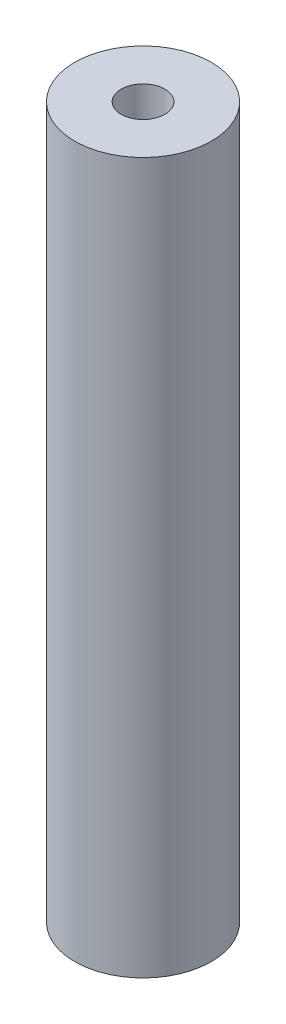
ISO-10303-21;
HEADER;
FILE_DESCRIPTION(('STEP AP214'),'2;1');
FILE_NAME('part.step','',(''),(''),'','','');
FILE_SCHEMA(('AUTOMOTIVE_DESIGN { 1 0 10303 214 1 1 1 1 }'));
ENDSEC;
DATA;
#1=APPLICATION_CONTEXT('core data for automotive mechanical design processes');
#2=APPLICATION_PROTOCOL_DEFINITION('international standard','automotive_design',2000,#1);
#3=PRODUCT_CONTEXT('',#1,'mechanical');
#4=PRODUCT('Part','Part','',(#3));
#5=PRODUCT_RELATED_PRODUCT_CATEGORY('part','',(#4));
#6=PRODUCT_DEFINITION_FORMATION('','',#4);
#7=PRODUCT_DEFINITION_CONTEXT('part definition',#1,'design');
#8=PRODUCT_DEFINITION('design','',#6,#7);
#9=PRODUCT_DEFINITION_SHAPE('','',#8);
#10=(LENGTH_UNIT() NAMED_UNIT(*) SI_UNIT(.MILLI.,.METRE.));
#11=(NAMED_UNIT(*) PLANE_ANGLE_UNIT() SI_UNIT($,.RADIAN.));
#12=(NAMED_UNIT(*) SI_UNIT($,.STERADIAN.) SOLID_ANGLE_UNIT());
#13=UNCERTAINTY_MEASURE_WITH_UNIT(LENGTH_MEASURE(1.E-05),#10,'distance_accuracy_value','');
#14=(GEOMETRIC_REPRESENTATION_CONTEXT(3) GLOBAL_UNCERTAINTY_ASSIGNED_CONTEXT((#13)) GLOBAL_UNIT_ASSIGNED_CONTEXT((#10,
#11,#12)) REPRESENTATION_CONTEXT('',''));
#15=CARTESIAN_POINT('',(0.,0.,0.));
#16=DIRECTION('',(0.,0.,1.));
#17=DIRECTION('',(1.,0.,0.));
#18=AXIS2_PLACEMENT_3D('',#15,#16,#17);
#19=CARTESIAN_POINT('',(0.,13.,0.));
#20=DIRECTION('',(0.,-1.,0.));
#21=DIRECTION('',(0.,0.,-1.));
#22=AXIS2_PLACEMENT_3D('',#19,#20,#21);
#23=CYLINDRICAL_SURFACE('',#22,2.5);
#24=CARTESIAN_POINT('',(0.,13.,0.));
#25=DIRECTION('',(0.,1.,0.));
#26=DIRECTION('',(0.,0.,1.));
#27=AXIS2_PLACEMENT_3D('',#24,#25,#26);
#28=CIRCLE('',#27,2.5);
#29=CARTESIAN_POINT('',(0.,13.,-2.5));
#30=VERTEX_POINT('',#29);
#31=EDGE_CURVE('E11',#30,#30,#28,.T.);
#32=CARTESIAN_POINT('',(0.,-13.,0.));
#33=DIRECTION('',(0.,1.,0.));
#34=DIRECTION('',(0.,0.,1.));
#35=AXIS2_PLACEMENT_3D('',#32,#33,#34);
#36=CIRCLE('',#35,2.5);
#37=CARTESIAN_POINT('',(0.,-13.,-2.5));
#38=VERTEX_POINT('',#37);
#39=EDGE_CURVE('E49',#38,#38,#36,.T.);
#40=CARTESIAN_POINT('',(0.,13.,-2.5));
#41=CARTESIAN_POINT('',(0.,12.7291666666667,-2.5));
#42=CARTESIAN_POINT('',(0.,12.4583333333333,-2.5));
#43=CARTESIAN_POINT('',(0.,11.9166666666667,-2.5));
#44=CARTESIAN_POINT('',(0.,11.6458333333333,-2.5));
#45=CARTESIAN_POINT('',(0.,11.1041666666667,-2.5));
#46=CARTESIAN_POINT('',(0.,10.8333333333333,-2.5));
#47=CARTESIAN_POINT('',(0.,10.2916666666667,-2.5));
#48=CARTESIAN_POINT('',(0.,10.0208333333333,-2.5));
#49=CARTESIAN_POINT('',(0.,9.47916666666667,-2.5));
#50=CARTESIAN_POINT('',(0.,9.20833333333333,-2.5));
#51=CARTESIAN_POINT('',(0.,8.66666666666667,-2.5));
#52=CARTESIAN_POINT('',(0.,8.39583333333333,-2.5));
#53=CARTESIAN_POINT('',(0.,7.85416666666667,-2.5));
#54=CARTESIAN_POINT('',(0.,7.58333333333333,-2.5));
#55=CARTESIAN_POINT('',(0.,7.04166666666667,-2.5));
#56=CARTESIAN_POINT('',(0.,6.77083333333333,-2.5));
#57=CARTESIAN_POINT('',(0.,6.22916666666667,-2.5));
#58=CARTESIAN_POINT('',(0.,5.95833333333333,-2.5));
#59=CARTESIAN_POINT('',(0.,5.41666666666667,-2.5));
#60=CARTESIAN_POINT('',(0.,5.14583333333333,-2.5));
#61=CARTESIAN_POINT('',(0.,4.60416666666667,-2.5));
#62=CARTESIAN_POINT('',(0.,4.33333333333333,-2.5));
#63=CARTESIAN_POINT('',(0.,3.79166666666667,-2.5));
#64=CARTESIAN_POINT('',(0.,3.52083333333333,-2.5));
#65=CARTESIAN_POINT('',(0.,2.97916666666666,-2.5));
#66=CARTESIAN_POINT('',(0.,2.70833333333333,-2.5));
#67=CARTESIAN_POINT('',(0.,2.16666666666667,-2.5));
#68=CARTESIAN_POINT('',(0.,1.89583333333333,-2.5));
#69=CARTESIAN_POINT('',(0.,1.35416666666666,-2.5));
#70=CARTESIAN_POINT('',(0.,1.08333333333333,-2.5));
#71=CARTESIAN_POINT('',(0.,0.541666666666665,-2.5));
#72=CARTESIAN_POINT('',(0.,0.270833333333332,-2.5));
#73=CARTESIAN_POINT('',(0.,-0.270833333333335,-2.5));
#74=CARTESIAN_POINT('',(0.,-0.541666666666669,-2.5));
#75=CARTESIAN_POINT('',(0.,-1.08333333333334,-2.5));
#76=CARTESIAN_POINT('',(0.,-1.35416666666667,-2.5));
#77=CARTESIAN_POINT('',(0.,-1.89583333333333,-2.5));
#78=CARTESIAN_POINT('',(0.,-2.16666666666667,-2.5));
#79=CARTESIAN_POINT('',(0.,-2.70833333333333,-2.5));
#80=CARTESIAN_POINT('',(0.,-2.97916666666667,-2.5));
#81=CARTESIAN_POINT('',(0.,-3.52083333333333,-2.5));
#82=CARTESIAN_POINT('',(0.,-3.79166666666667,-2.5));
#83=CARTESIAN_POINT('',(0.,-4.33333333333333,-2.5));
#84=CARTESIAN_POINT('',(0.,-4.60416666666667,-2.5));
#85=CARTESIAN_POINT('',(0.,-5.14583333333333,-2.5));
#86=CARTESIAN_POINT('',(0.,-5.41666666666667,-2.5));
#87=CARTESIAN_POINT('',(0.,-5.95833333333333,-2.5));
#88=CARTESIAN_POINT('',(0.,-6.22916666666667,-2.5));
#89=CARTESIAN_POINT('',(0.,-6.77083333333333,-2.5));
#90=CARTESIAN_POINT('',(0.,-7.04166666666667,-2.5));
#91=CARTESIAN_POINT('',(0.,-7.58333333333333,-2.5));
#92=CARTESIAN_POINT('',(0.,-7.85416666666667,-2.5));
#93=CARTESIAN_POINT('',(0.,-8.39583333333333,-2.5));
#94=CARTESIAN_POINT('',(0.,-8.66666666666667,-2.5));
#95=CARTESIAN_POINT('',(0.,-9.20833333333333,-2.5));
#96=CARTESIAN_POINT('',(0.,-9.47916666666667,-2.5));
#97=CARTESIAN_POINT('',(0.,-10.0208333333333,-2.5));
#98=CARTESIAN_POINT('',(0.,-10.2916666666667,-2.5));
#99=CARTESIAN_POINT('',(0.,-10.8333333333333,-2.5));
#100=CARTESIAN_POINT('',(0.,-11.1041666666667,-2.5));
#101=CARTESIAN_POINT('',(0.,-11.6458333333333,-2.5));
#102=CARTESIAN_POINT('',(0.,-11.9166666666667,-2.5));
#103=CARTESIAN_POINT('',(0.,-12.4583333333333,-2.5));
#104=CARTESIAN_POINT('',(0.,-12.7291666666667,-2.5));
#105=CARTESIAN_POINT('',(0.,-13.,-2.5));
#106=B_SPLINE_CURVE_WITH_KNOTS('',3,(#40,#41,#42,#43,#44,#45,#46,#47,#48,#49,#50,#51,#52,#53,
#54,#55,#56,#57,#58,#59,#60,#61,#62,#63,#64,#65,#66,#67,#68,#69,#70,#71,#72,#73,#74,#75,#76,#77,
#78,#79,#80,#81,#82,#83,#84,#85,#86,#87,#88,#89,#90,#91,#92,#93,#94,#95,#96,#97,#98,#99,#100,
#101,#102,#103,#104,#105),.UNSPECIFIED.,.F.,.F.,(4,2,2,2,2,2,2,2,2,2,2,2,2,2,2,2,2,2,2,2,2,2,2,
2,2,2,2,2,2,2,2,2,4),(0.,0.812499999999999,1.625,2.4375,3.25,4.0625,4.875,5.6875,6.5,7.3125,
8.125,8.9375,9.75,10.5625,11.375,12.1875,13.,13.8125,14.625,15.4375,16.25,17.0625,17.875,
18.6875,19.5,20.3125,21.125,21.9375,22.75,23.5625,24.375,25.1875,26.),.UNSPECIFIED.);
#107=EDGE_CURVE('BSEAM46',#30,#38,#106,.T.);
#108=ORIENTED_EDGE('',*,*,#31,.F.);
#109=ORIENTED_EDGE('',*,*,#39,.T.);
#110=ORIENTED_EDGE('',*,*,#107,.T.);
#111=ORIENTED_EDGE('',*,*,#107,.F.);
#112=EDGE_LOOP('',(#108,#110,#109,#111));
#113=FACE_BOUND('',#112,.T.);
#114=ADVANCED_FACE('F46',(#113),#23,.T.);
#115=CARTESIAN_POINT('',(0.,13.,0.));
#116=DIRECTION('',(0.,1.,0.));
#117=DIRECTION('',(0.,0.,1.));
#118=AXIS2_PLACEMENT_3D('',#115,#116,#117);
#119=PLANE('',#118);
#120=CARTESIAN_POINT('',(0.,13.,0.));
#121=DIRECTION('',(0.,1.,0.));
#122=DIRECTION('',(0.,0.,1.));
#123=AXIS2_PLACEMENT_3D('',#120,#121,#122);
#124=CIRCLE('',#123,0.79999999999999);
#125=CARTESIAN_POINT('',(0.,13.,0.79999999999999));
#126=VERTEX_POINT('',#125);
#127=EDGE_CURVE('E72',#126,#126,#124,.T.);
#128=ORIENTED_EDGE('',*,*,#127,.F.);
#129=EDGE_LOOP('',(#128));
#130=FACE_BOUND('',#129,.T.);
#131=ORIENTED_EDGE('',*,*,#31,.T.);
#132=EDGE_LOOP('',(#131));
#133=FACE_BOUND('',#132,.T.);
#134=ADVANCED_FACE('F97',(#130,#133),#119,.T.);
#135=CARTESIAN_POINT('',(0.,-13.,0.));
#136=DIRECTION('',(0.,1.,0.));
#137=DIRECTION('',(0.,0.,1.));
#138=AXIS2_PLACEMENT_3D('',#135,#136,#137);
#139=PLANE('',#138);
#140=CARTESIAN_POINT('',(0.,-13.,0.));
#141=DIRECTION('',(0.,-1.,0.));
#142=DIRECTION('',(0.,0.,-1.));
#143=AXIS2_PLACEMENT_3D('',#140,#141,#142);
#144=CIRCLE('',#143,0.79999999999999);
#145=CARTESIAN_POINT('',(0.,-13.,-0.79999999999999));
#146=VERTEX_POINT('',#145);
#147=EDGE_CURVE('E71',#146,#146,#144,.T.);
#148=ORIENTED_EDGE('',*,*,#147,.F.);
#149=EDGE_LOOP('',(#148));
#150=FACE_BOUND('',#149,.T.);
#151=ORIENTED_EDGE('',*,*,#39,.F.);
#152=EDGE_LOOP('',(#151));
#153=FACE_BOUND('',#152,.T.);
#154=ADVANCED_FACE('F94',(#150,#153),#139,.F.);
#155=CARTESIAN_POINT('',(0.,-7.8,0.));
#156=DIRECTION('',(0.,-1.,0.));
#157=DIRECTION('',(0.,0.,-1.));
#158=AXIS2_PLACEMENT_3D('',#155,#156,#157);
#159=CONICAL_SURFACE('',#158,0.799999999999988,1.02974425867664);
#160=CARTESIAN_POINT('',(0.,-7.31931150477795,0.));
#161=VERTEX_POINT('',#160);
#162=VERTEX_LOOP('',#161);
#163=FACE_BOUND('',#162,.T.);
#164=CARTESIAN_POINT('',(0.,-7.8,0.));
#165=DIRECTION('',(0.,-1.,0.));
#166=DIRECTION('',(0.,0.,-1.));
#167=AXIS2_PLACEMENT_3D('',#164,#165,#166);
#168=CIRCLE('',#167,0.799999999999988);
#169=CARTESIAN_POINT('',(0.,-7.8,-0.799999999999988));
#170=VERTEX_POINT('',#169);
#171=EDGE_CURVE('E78',#170,#170,#168,.T.);
#172=ORIENTED_EDGE('',*,*,#171,.T.);
#173=EDGE_LOOP('',(#172));
#174=FACE_BOUND('',#173,.T.);
#175=ADVANCED_FACE('F96',(#163,#174),#159,.F.);
#176=CARTESIAN_POINT('',(0.,-13.,0.));
#177=DIRECTION('',(0.,-1.,0.));
#178=DIRECTION('',(0.,0.,-1.));
#179=AXIS2_PLACEMENT_3D('',#176,#177,#178);
#180=CYLINDRICAL_SURFACE('',#179,0.799999999999989);
#181=ORIENTED_EDGE('',*,*,#171,.F.);
#182=EDGE_LOOP('',(#181));
#183=FACE_BOUND('',#182,.T.);
#184=ORIENTED_EDGE('',*,*,#147,.T.);
#185=EDGE_LOOP('',(#184));
#186=FACE_BOUND('',#185,.T.);
#187=ADVANCED_FACE('F64',(#183,#186),#180,.F.);
#188=CARTESIAN_POINT('',(0.,7.8,0.));
#189=DIRECTION('',(0.,1.,0.));
#190=DIRECTION('',(0.,0.,1.));
#191=AXIS2_PLACEMENT_3D('',#188,#189,#190);
#192=CONICAL_SURFACE('',#191,0.799999999999988,1.02974425867664);
#193=CARTESIAN_POINT('',(0.,7.31931150477795,0.));
#194=VERTEX_POINT('',#193);
#195=VERTEX_LOOP('',#194);
#196=FACE_BOUND('',#195,.T.);
#197=CARTESIAN_POINT('',(0.,7.8,0.));
#198=DIRECTION('',(0.,1.,0.));
#199=DIRECTION('',(0.,0.,1.));
#200=AXIS2_PLACEMENT_3D('',#197,#198,#199);
#201=CIRCLE('',#200,0.799999999999988);
#202=CARTESIAN_POINT('',(0.,7.8,0.799999999999988));
#203=VERTEX_POINT('',#202);
#204=EDGE_CURVE('E68',#203,#203,#201,.T.);
#205=ORIENTED_EDGE('',*,*,#204,.T.);
#206=EDGE_LOOP('',(#205));
#207=FACE_BOUND('',#206,.T.);
#208=ADVANCED_FACE('F60',(#196,#207),#192,.F.);
#209=CARTESIAN_POINT('',(0.,13.,0.));
#210=DIRECTION('',(0.,1.,0.));
#211=DIRECTION('',(0.,0.,1.));
#212=AXIS2_PLACEMENT_3D('',#209,#210,#211);
#213=CYLINDRICAL_SURFACE('',#212,0.799999999999989);
#214=ORIENTED_EDGE('',*,*,#204,.F.);
#215=EDGE_LOOP('',(#214));
#216=FACE_BOUND('',#215,.T.);
#217=ORIENTED_EDGE('',*,*,#127,.T.);
#218=EDGE_LOOP('',(#217));
#219=FACE_BOUND('',#218,.T.);
#220=ADVANCED_FACE('F63',(#216,#219),#213,.F.);
#221=CLOSED_SHELL('',(#114,#134,#154,#175,#187,#208,#220));
#222=MANIFOLD_SOLID_BREP('B2',#221);
#223=ADVANCED_BREP_SHAPE_REPRESENTATION('',(#18,#222),#14);
#224=SHAPE_DEFINITION_REPRESENTATION(#9,#223);
ENDSEC;
END-ISO-10303-21;
